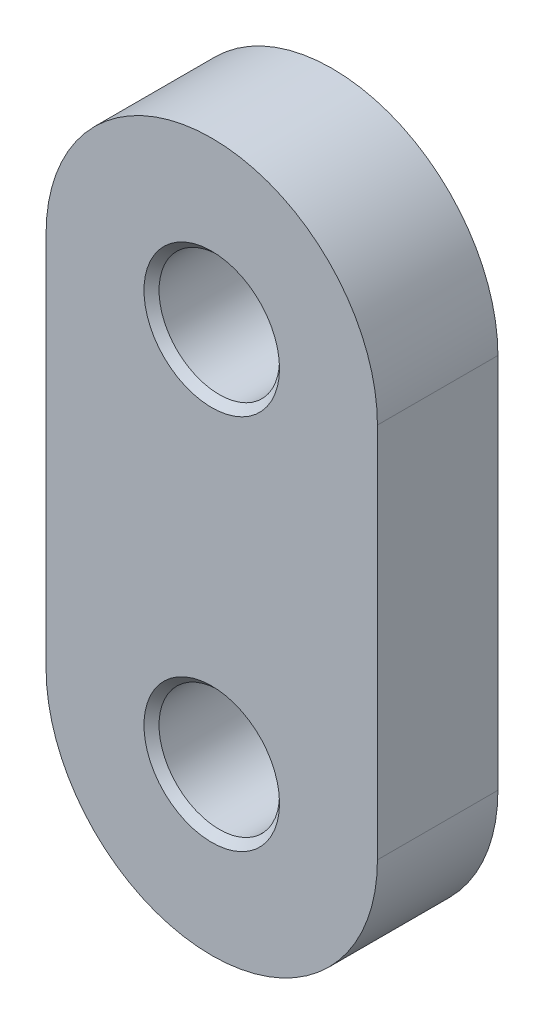
ISO-10303-21;
HEADER;
FILE_DESCRIPTION(('STEP AP214'),'2;1');
FILE_NAME('part.step','',(''),(''),'','','');
FILE_SCHEMA(('AUTOMOTIVE_DESIGN { 1 0 10303 214 1 1 1 1 }'));
ENDSEC;
DATA;
#1=APPLICATION_CONTEXT('core data for automotive mechanical design processes');
#2=APPLICATION_PROTOCOL_DEFINITION('international standard','automotive_design',2000,#1);
#3=PRODUCT_CONTEXT('',#1,'mechanical');
#4=PRODUCT('Part','Part','',(#3));
#5=PRODUCT_RELATED_PRODUCT_CATEGORY('part','',(#4));
#6=PRODUCT_DEFINITION_FORMATION('','',#4);
#7=PRODUCT_DEFINITION_CONTEXT('part definition',#1,'design');
#8=PRODUCT_DEFINITION('design','',#6,#7);
#9=PRODUCT_DEFINITION_SHAPE('','',#8);
#10=(LENGTH_UNIT() NAMED_UNIT(*) SI_UNIT(.MILLI.,.METRE.));
#11=(NAMED_UNIT(*) PLANE_ANGLE_UNIT() SI_UNIT($,.RADIAN.));
#12=(NAMED_UNIT(*) SI_UNIT($,.STERADIAN.) SOLID_ANGLE_UNIT());
#13=UNCERTAINTY_MEASURE_WITH_UNIT(LENGTH_MEASURE(1.E-05),#10,'distance_accuracy_value','');
#14=(GEOMETRIC_REPRESENTATION_CONTEXT(3) GLOBAL_UNCERTAINTY_ASSIGNED_CONTEXT((#13)) GLOBAL_UNIT_ASSIGNED_CONTEXT((#10,
#11,#12)) REPRESENTATION_CONTEXT('',''));
#15=CARTESIAN_POINT('',(0.,0.,0.));
#16=DIRECTION('',(0.,0.,1.));
#17=DIRECTION('',(1.,0.,0.));
#18=AXIS2_PLACEMENT_3D('',#15,#16,#17);
#19=CARTESIAN_POINT('',(0.,0.,8.));
#20=DIRECTION('',(0.,0.,-1.));
#21=DIRECTION('',(-1.,0.,0.));
#22=AXIS2_PLACEMENT_3D('',#19,#20,#21);
#23=CYLINDRICAL_SURFACE('',#22,11.);
#24=CARTESIAN_POINT('',(0.,0.,0.));
#25=DIRECTION('',(0.,0.,1.));
#26=DIRECTION('',(1.,0.,0.));
#27=AXIS2_PLACEMENT_3D('',#24,#25,#26);
#28=CIRCLE('',#27,11.);
#29=CARTESIAN_POINT('',(11.,0.,0.));
#30=VERTEX_POINT('',#29);
#31=CARTESIAN_POINT('',(-11.,0.,0.));
#32=VERTEX_POINT('',#31);
#33=EDGE_CURVE('E77',#30,#32,#28,.T.);
#34=ORIENTED_EDGE('',*,*,#33,.T.);
#35=DIRECTION('',(0.,0.,-1.));
#36=VECTOR('',#35,1.);
#37=CARTESIAN_POINT('',(-11.,0.,8.));
#38=LINE('',#37,#36);
#39=CARTESIAN_POINT('',(-11.,0.,8.));
#40=VERTEX_POINT('',#39);
#41=EDGE_CURVE('E84',#40,#32,#38,.T.);
#42=ORIENTED_EDGE('',*,*,#41,.F.);
#43=CARTESIAN_POINT('',(0.,0.,8.));
#44=DIRECTION('',(0.,0.,1.));
#45=DIRECTION('',(1.,0.,0.));
#46=AXIS2_PLACEMENT_3D('',#43,#44,#45);
#47=CIRCLE('',#46,11.);
#48=CARTESIAN_POINT('',(11.,0.,8.));
#49=VERTEX_POINT('',#48);
#50=EDGE_CURVE('E99',#49,#40,#47,.T.);
#51=ORIENTED_EDGE('',*,*,#50,.F.);
#52=DIRECTION('',(0.,0.,-1.));
#53=VECTOR('',#52,1.);
#54=CARTESIAN_POINT('',(11.,0.,8.));
#55=LINE('',#54,#53);
#56=EDGE_CURVE('E93',#49,#30,#55,.T.);
#57=ORIENTED_EDGE('',*,*,#56,.T.);
#58=EDGE_LOOP('',(#34,#42,#51,#57));
#59=FACE_BOUND('',#58,.T.);
#60=ADVANCED_FACE('F32',(#59),#23,.T.);
#61=CARTESIAN_POINT('',(-11.,0.,8.));
#62=DIRECTION('',(1.,0.,0.));
#63=DIRECTION('',(0.,1.,0.));
#64=AXIS2_PLACEMENT_3D('',#61,#62,#63);
#65=PLANE('',#64);
#66=DIRECTION('',(0.,-1.,0.));
#67=VECTOR('',#66,1.);
#68=CARTESIAN_POINT('',(-11.,0.,0.));
#69=LINE('',#68,#67);
#70=CARTESIAN_POINT('',(-11.,-25.,0.));
#71=VERTEX_POINT('',#70);
#72=EDGE_CURVE('E72',#32,#71,#69,.T.);
#73=ORIENTED_EDGE('',*,*,#72,.T.);
#74=DIRECTION('',(0.,0.,-1.));
#75=VECTOR('',#74,1.);
#76=CARTESIAN_POINT('',(-11.,-25.,8.));
#77=LINE('',#76,#75);
#78=CARTESIAN_POINT('',(-11.,-25.,8.));
#79=VERTEX_POINT('',#78);
#80=EDGE_CURVE('E90',#79,#71,#77,.T.);
#81=ORIENTED_EDGE('',*,*,#80,.F.);
#82=DIRECTION('',(0.,-1.,0.));
#83=VECTOR('',#82,1.);
#84=CARTESIAN_POINT('',(-11.,0.,8.));
#85=LINE('',#84,#83);
#86=EDGE_CURVE('E86',#40,#79,#85,.T.);
#87=ORIENTED_EDGE('',*,*,#86,.F.);
#88=ORIENTED_EDGE('',*,*,#41,.T.);
#89=EDGE_LOOP('',(#73,#81,#87,#88));
#90=FACE_BOUND('',#89,.T.);
#91=ADVANCED_FACE('F85',(#90),#65,.F.);
#92=CARTESIAN_POINT('',(0.,-25.,8.));
#93=DIRECTION('',(0.,0.,-1.));
#94=DIRECTION('',(-1.,0.,0.));
#95=AXIS2_PLACEMENT_3D('',#92,#93,#94);
#96=CYLINDRICAL_SURFACE('',#95,11.);
#97=CARTESIAN_POINT('',(0.,-25.,0.));
#98=DIRECTION('',(0.,0.,1.));
#99=DIRECTION('',(1.,0.,0.));
#100=AXIS2_PLACEMENT_3D('',#97,#98,#99);
#101=CIRCLE('',#100,11.);
#102=CARTESIAN_POINT('',(11.,-25.,0.));
#103=VERTEX_POINT('',#102);
#104=EDGE_CURVE('E78',#71,#103,#101,.T.);
#105=ORIENTED_EDGE('',*,*,#104,.T.);
#106=DIRECTION('',(0.,0.,-1.));
#107=VECTOR('',#106,1.);
#108=CARTESIAN_POINT('',(11.,-25.,8.));
#109=LINE('',#108,#107);
#110=CARTESIAN_POINT('',(11.,-25.,8.));
#111=VERTEX_POINT('',#110);
#112=EDGE_CURVE('E105',#111,#103,#109,.T.);
#113=ORIENTED_EDGE('',*,*,#112,.F.);
#114=CARTESIAN_POINT('',(0.,-25.,8.));
#115=DIRECTION('',(0.,0.,1.));
#116=DIRECTION('',(1.,0.,0.));
#117=AXIS2_PLACEMENT_3D('',#114,#115,#116);
#118=CIRCLE('',#117,11.);
#119=EDGE_CURVE('E51',#79,#111,#118,.T.);
#120=ORIENTED_EDGE('',*,*,#119,.F.);
#121=ORIENTED_EDGE('',*,*,#80,.T.);
#122=EDGE_LOOP('',(#105,#113,#120,#121));
#123=FACE_BOUND('',#122,.T.);
#124=ADVANCED_FACE('F146',(#123),#96,.T.);
#125=CARTESIAN_POINT('',(11.,-25.,8.));
#126=DIRECTION('',(-1.,0.,0.));
#127=DIRECTION('',(0.,-1.,0.));
#128=AXIS2_PLACEMENT_3D('',#125,#126,#127);
#129=PLANE('',#128);
#130=DIRECTION('',(0.,1.,0.));
#131=VECTOR('',#130,1.);
#132=CARTESIAN_POINT('',(11.,-25.,0.));
#133=LINE('',#132,#131);
#134=EDGE_CURVE('E97',#103,#30,#133,.T.);
#135=ORIENTED_EDGE('',*,*,#134,.T.);
#136=ORIENTED_EDGE('',*,*,#56,.F.);
#137=DIRECTION('',(0.,1.,0.));
#138=VECTOR('',#137,1.);
#139=CARTESIAN_POINT('',(11.,-25.,8.));
#140=LINE('',#139,#138);
#141=EDGE_CURVE('E46',#111,#49,#140,.T.);
#142=ORIENTED_EDGE('',*,*,#141,.F.);
#143=ORIENTED_EDGE('',*,*,#112,.T.);
#144=EDGE_LOOP('',(#135,#136,#142,#143));
#145=FACE_BOUND('',#144,.T.);
#146=ADVANCED_FACE('F150',(#145),#129,.F.);
#147=CARTESIAN_POINT('',(0.,0.,8.));
#148=DIRECTION('',(0.,0.,1.));
#149=DIRECTION('',(1.,0.,0.));
#150=AXIS2_PLACEMENT_3D('',#147,#148,#149);
#151=PLANE('',#150);
#152=CARTESIAN_POINT('',(0.,0.,8.));
#153=DIRECTION('',(0.,0.,1.));
#154=DIRECTION('',(1.,0.,0.));
#155=AXIS2_PLACEMENT_3D('',#152,#153,#154);
#156=CIRCLE('',#155,4.5);
#157=CARTESIAN_POINT('',(4.5,0.,8.));
#158=VERTEX_POINT('',#157);
#159=EDGE_CURVE('E117',#158,#158,#156,.F.);
#160=ORIENTED_EDGE('',*,*,#159,.T.);
#161=EDGE_LOOP('',(#160));
#162=FACE_BOUND('',#161,.T.);
#163=CARTESIAN_POINT('',(0.,-25.,8.));
#164=DIRECTION('',(0.,0.,1.));
#165=DIRECTION('',(1.,0.,0.));
#166=AXIS2_PLACEMENT_3D('',#163,#164,#165);
#167=CIRCLE('',#166,4.5);
#168=CARTESIAN_POINT('',(4.5,-25.,8.));
#169=VERTEX_POINT('',#168);
#170=EDGE_CURVE('E114',#169,#169,#167,.F.);
#171=ORIENTED_EDGE('',*,*,#170,.T.);
#172=EDGE_LOOP('',(#171));
#173=FACE_BOUND('',#172,.T.);
#174=ORIENTED_EDGE('',*,*,#50,.T.);
#175=ORIENTED_EDGE('',*,*,#86,.T.);
#176=ORIENTED_EDGE('',*,*,#119,.T.);
#177=ORIENTED_EDGE('',*,*,#141,.T.);
#178=EDGE_LOOP('',(#174,#175,#176,#177));
#179=FACE_BOUND('',#178,.T.);
#180=ADVANCED_FACE('F156',(#162,#173,#179),#151,.T.);
#181=CARTESIAN_POINT('',(0.,0.,0.));
#182=DIRECTION('',(0.,0.,1.));
#183=DIRECTION('',(1.,0.,0.));
#184=AXIS2_PLACEMENT_3D('',#181,#182,#183);
#185=PLANE('',#184);
#186=CARTESIAN_POINT('',(0.,0.,0.));
#187=DIRECTION('',(0.,0.,1.));
#188=DIRECTION('',(1.,0.,0.));
#189=AXIS2_PLACEMENT_3D('',#186,#187,#188);
#190=CIRCLE('',#189,4.50000000000001);
#191=CARTESIAN_POINT('',(4.50000000000001,0.,0.));
#192=VERTEX_POINT('',#191);
#193=EDGE_CURVE('E123',#192,#192,#190,.T.);
#194=ORIENTED_EDGE('',*,*,#193,.T.);
#195=EDGE_LOOP('',(#194));
#196=FACE_BOUND('',#195,.T.);
#197=CARTESIAN_POINT('',(0.,-25.,0.));
#198=DIRECTION('',(0.,0.,1.));
#199=DIRECTION('',(1.,0.,0.));
#200=AXIS2_PLACEMENT_3D('',#197,#198,#199);
#201=CIRCLE('',#200,4.5);
#202=CARTESIAN_POINT('',(4.5,-25.,0.));
#203=VERTEX_POINT('',#202);
#204=EDGE_CURVE('E120',#203,#203,#201,.T.);
#205=ORIENTED_EDGE('',*,*,#204,.T.);
#206=EDGE_LOOP('',(#205));
#207=FACE_BOUND('',#206,.T.);
#208=ORIENTED_EDGE('',*,*,#33,.F.);
#209=ORIENTED_EDGE('',*,*,#134,.F.);
#210=ORIENTED_EDGE('',*,*,#104,.F.);
#211=ORIENTED_EDGE('',*,*,#72,.F.);
#212=EDGE_LOOP('',(#208,#209,#210,#211));
#213=FACE_BOUND('',#212,.T.);
#214=ADVANCED_FACE('F74',(#196,#207,#213),#185,.F.);
#215=CARTESIAN_POINT('',(0.,0.,0.));
#216=DIRECTION('',(0.,0.,1.));
#217=DIRECTION('',(1.,0.,0.));
#218=AXIS2_PLACEMENT_3D('',#215,#216,#217);
#219=CYLINDRICAL_SURFACE('',#218,4.);
#220=CARTESIAN_POINT('',(0.,0.,7.49999999999999));
#221=DIRECTION('',(0.,0.,1.));
#222=DIRECTION('',(1.,0.,0.));
#223=AXIS2_PLACEMENT_3D('',#220,#221,#222);
#224=CIRCLE('',#223,4.);
#225=CARTESIAN_POINT('',(4.,0.,7.49999999999999));
#226=VERTEX_POINT('',#225);
#227=EDGE_CURVE('E111',#226,#226,#224,.T.);
#228=ORIENTED_EDGE('',*,*,#227,.T.);
#229=EDGE_LOOP('',(#228));
#230=FACE_BOUND('',#229,.T.);
#231=CARTESIAN_POINT('',(0.,0.,0.500000000000004));
#232=DIRECTION('',(0.,0.,1.));
#233=DIRECTION('',(1.,0.,0.));
#234=AXIS2_PLACEMENT_3D('',#231,#232,#233);
#235=CIRCLE('',#234,4.);
#236=CARTESIAN_POINT('',(4.,0.,0.500000000000004));
#237=VERTEX_POINT('',#236);
#238=EDGE_CURVE('E89',#237,#237,#235,.F.);
#239=ORIENTED_EDGE('',*,*,#238,.T.);
#240=EDGE_LOOP('',(#239));
#241=FACE_BOUND('',#240,.T.);
#242=ADVANCED_FACE('F163',(#230,#241),#219,.F.);
#243=CARTESIAN_POINT('',(0.,-25.,0.));
#244=DIRECTION('',(0.,0.,1.));
#245=DIRECTION('',(1.,0.,0.));
#246=AXIS2_PLACEMENT_3D('',#243,#244,#245);
#247=CYLINDRICAL_SURFACE('',#246,4.);
#248=CARTESIAN_POINT('',(0.,-25.,0.500000000000009));
#249=DIRECTION('',(0.,0.,1.));
#250=DIRECTION('',(1.,0.,0.));
#251=AXIS2_PLACEMENT_3D('',#248,#249,#250);
#252=CIRCLE('',#251,4.);
#253=CARTESIAN_POINT('',(4.,-25.,0.500000000000009));
#254=VERTEX_POINT('',#253);
#255=EDGE_CURVE('E11',#254,#254,#252,.F.);
#256=ORIENTED_EDGE('',*,*,#255,.T.);
#257=EDGE_LOOP('',(#256));
#258=FACE_BOUND('',#257,.T.);
#259=CARTESIAN_POINT('',(0.,-25.,7.49999999999999));
#260=DIRECTION('',(0.,0.,1.));
#261=DIRECTION('',(1.,0.,0.));
#262=AXIS2_PLACEMENT_3D('',#259,#260,#261);
#263=CIRCLE('',#262,4.);
#264=CARTESIAN_POINT('',(4.,-25.,7.49999999999999));
#265=VERTEX_POINT('',#264);
#266=EDGE_CURVE('E39',#265,#265,#263,.T.);
#267=ORIENTED_EDGE('',*,*,#266,.T.);
#268=EDGE_LOOP('',(#267));
#269=FACE_BOUND('',#268,.T.);
#270=ADVANCED_FACE('F128',(#258,#269),#247,.F.);
#271=CARTESIAN_POINT('',(0.,0.,7.49999999999999));
#272=DIRECTION('',(0.,0.,1.));
#273=DIRECTION('',(1.,0.,0.));
#274=AXIS2_PLACEMENT_3D('',#271,#272,#273);
#275=CONICAL_SURFACE('',#274,4.,0.785398163397443);
#276=ORIENTED_EDGE('',*,*,#159,.F.);
#277=EDGE_LOOP('',(#276));
#278=FACE_BOUND('',#277,.T.);
#279=ORIENTED_EDGE('',*,*,#227,.F.);
#280=EDGE_LOOP('',(#279));
#281=FACE_BOUND('',#280,.T.);
#282=ADVANCED_FACE('F170',(#278,#281),#275,.F.);
#283=CARTESIAN_POINT('',(0.,0.,0.));
#284=DIRECTION('',(0.,0.,-1.));
#285=DIRECTION('',(-1.,0.,0.));
#286=AXIS2_PLACEMENT_3D('',#283,#284,#285);
#287=CONICAL_SURFACE('',#286,4.50000000000001,0.785398163397454);
#288=ORIENTED_EDGE('',*,*,#238,.F.);
#289=EDGE_LOOP('',(#288));
#290=FACE_BOUND('',#289,.T.);
#291=ORIENTED_EDGE('',*,*,#193,.F.);
#292=EDGE_LOOP('',(#291));
#293=FACE_BOUND('',#292,.T.);
#294=ADVANCED_FACE('F138',(#290,#293),#287,.F.);
#295=CARTESIAN_POINT('',(0.,-25.,0.));
#296=DIRECTION('',(0.,0.,-1.));
#297=DIRECTION('',(-1.,0.,0.));
#298=AXIS2_PLACEMENT_3D('',#295,#296,#297);
#299=CONICAL_SURFACE('',#298,4.5,0.785398163397443);
#300=ORIENTED_EDGE('',*,*,#255,.F.);
#301=EDGE_LOOP('',(#300));
#302=FACE_BOUND('',#301,.T.);
#303=ORIENTED_EDGE('',*,*,#204,.F.);
#304=EDGE_LOOP('',(#303));
#305=FACE_BOUND('',#304,.T.);
#306=ADVANCED_FACE('F132',(#302,#305),#299,.F.);
#307=CARTESIAN_POINT('',(0.,-25.,7.49999999999999));
#308=DIRECTION('',(0.,0.,1.));
#309=DIRECTION('',(1.,0.,0.));
#310=AXIS2_PLACEMENT_3D('',#307,#308,#309);
#311=CONICAL_SURFACE('',#310,4.,0.785398163397443);
#312=ORIENTED_EDGE('',*,*,#170,.F.);
#313=EDGE_LOOP('',(#312));
#314=FACE_BOUND('',#313,.T.);
#315=ORIENTED_EDGE('',*,*,#266,.F.);
#316=EDGE_LOOP('',(#315));
#317=FACE_BOUND('',#316,.T.);
#318=ADVANCED_FACE('F130',(#314,#317),#311,.F.);
#319=CLOSED_SHELL('',(#60,#91,#124,#146,#180,#214,#242,#270,#282,#294,#306,#318));
#320=MANIFOLD_SOLID_BREP('B2',#319);
#321=ADVANCED_BREP_SHAPE_REPRESENTATION('',(#18,#320),#14);
#322=SHAPE_DEFINITION_REPRESENTATION(#9,#321);
ENDSEC;
END-ISO-10303-21;
